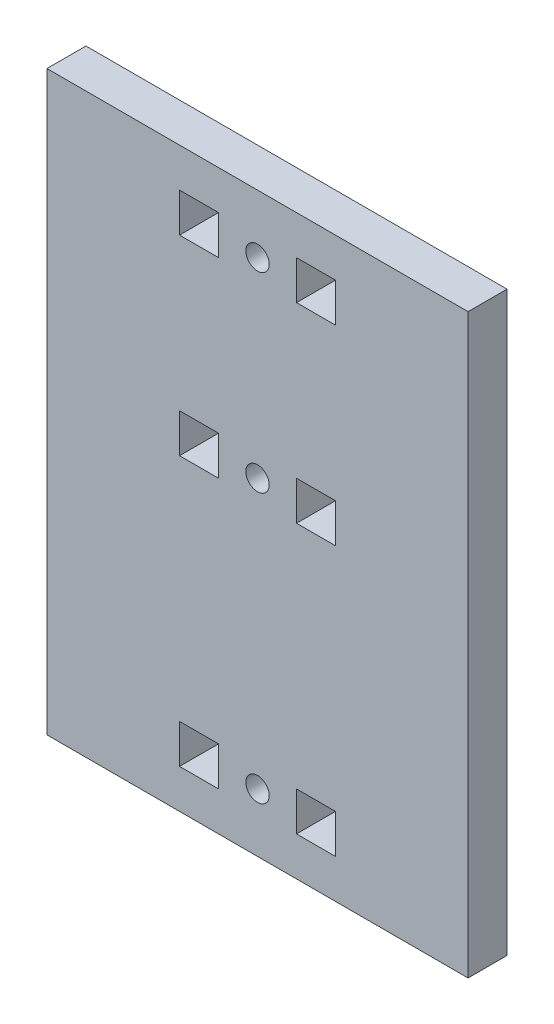
ISO-10303-21;
HEADER;
FILE_DESCRIPTION(('STEP AP214'),'2;1');
FILE_NAME('part.step','',(''),(''),'','','');
FILE_SCHEMA(('AUTOMOTIVE_DESIGN { 1 0 10303 214 1 1 1 1 }'));
ENDSEC;
DATA;
#1=APPLICATION_CONTEXT('core data for automotive mechanical design processes');
#2=APPLICATION_PROTOCOL_DEFINITION('international standard','automotive_design',2000,#1);
#3=PRODUCT_CONTEXT('',#1,'mechanical');
#4=PRODUCT('Part','Part','',(#3));
#5=PRODUCT_RELATED_PRODUCT_CATEGORY('part','',(#4));
#6=PRODUCT_DEFINITION_FORMATION('','',#4);
#7=PRODUCT_DEFINITION_CONTEXT('part definition',#1,'design');
#8=PRODUCT_DEFINITION('design','',#6,#7);
#9=PRODUCT_DEFINITION_SHAPE('','',#8);
#10=(LENGTH_UNIT() NAMED_UNIT(*) SI_UNIT(.MILLI.,.METRE.));
#11=(NAMED_UNIT(*) PLANE_ANGLE_UNIT() SI_UNIT($,.RADIAN.));
#12=(NAMED_UNIT(*) SI_UNIT($,.STERADIAN.) SOLID_ANGLE_UNIT());
#13=UNCERTAINTY_MEASURE_WITH_UNIT(LENGTH_MEASURE(1.E-05),#10,'distance_accuracy_value','');
#14=(GEOMETRIC_REPRESENTATION_CONTEXT(3) GLOBAL_UNCERTAINTY_ASSIGNED_CONTEXT((#13)) GLOBAL_UNIT_ASSIGNED_CONTEXT((#10,
#11,#12)) REPRESENTATION_CONTEXT('',''));
#15=CARTESIAN_POINT('',(0.,0.,0.));
#16=DIRECTION('',(0.,0.,1.));
#17=DIRECTION('',(1.,0.,0.));
#18=AXIS2_PLACEMENT_3D('',#15,#16,#17);
#19=CARTESIAN_POINT('',(0.,0.,5.));
#20=DIRECTION('',(0.,0.,-1.));
#21=DIRECTION('',(-1.,0.,0.));
#22=AXIS2_PLACEMENT_3D('',#19,#20,#21);
#23=PLANE('',#22);
#24=DIRECTION('',(0.,1.,0.));
#25=VECTOR('',#24,1.);
#26=CARTESIAN_POINT('',(-5.,-32.,5.));
#27=LINE('',#26,#25);
#28=CARTESIAN_POINT('',(-5.,-37.,5.));
#29=VERTEX_POINT('',#28);
#30=CARTESIAN_POINT('',(-5.,-32.,5.));
#31=VERTEX_POINT('',#30);
#32=EDGE_CURVE('E257',#29,#31,#27,.T.);
#33=ORIENTED_EDGE('',*,*,#32,.F.);
#34=DIRECTION('',(1.,0.,0.));
#35=VECTOR('',#34,1.);
#36=CARTESIAN_POINT('',(-5.,-37.,5.));
#37=LINE('',#36,#35);
#38=CARTESIAN_POINT('',(-10.,-37.,5.));
#39=VERTEX_POINT('',#38);
#40=EDGE_CURVE('E265',#39,#29,#37,.T.);
#41=ORIENTED_EDGE('',*,*,#40,.F.);
#42=DIRECTION('',(0.,-1.,0.));
#43=VECTOR('',#42,1.);
#44=CARTESIAN_POINT('',(-10.,-32.,5.));
#45=LINE('',#44,#43);
#46=CARTESIAN_POINT('',(-10.,-32.,5.));
#47=VERTEX_POINT('',#46);
#48=EDGE_CURVE('E262',#47,#39,#45,.T.);
#49=ORIENTED_EDGE('',*,*,#48,.F.);
#50=DIRECTION('',(-1.,0.,0.));
#51=VECTOR('',#50,1.);
#52=CARTESIAN_POINT('',(-5.,-32.,5.));
#53=LINE('',#52,#51);
#54=EDGE_CURVE('E259',#31,#47,#53,.T.);
#55=ORIENTED_EDGE('',*,*,#54,.F.);
#56=EDGE_LOOP('',(#33,#41,#49,#55));
#57=FACE_BOUND('',#56,.T.);
#58=DIRECTION('',(0.,1.,0.));
#59=VECTOR('',#58,1.);
#60=CARTESIAN_POINT('',(-5.,27.,5.));
#61=LINE('',#60,#59);
#62=CARTESIAN_POINT('',(-5.,22.,5.));
#63=VERTEX_POINT('',#62);
#64=CARTESIAN_POINT('',(-5.,27.,5.));
#65=VERTEX_POINT('',#64);
#66=EDGE_CURVE('E325',#63,#65,#61,.T.);
#67=ORIENTED_EDGE('',*,*,#66,.F.);
#68=DIRECTION('',(1.,0.,0.));
#69=VECTOR('',#68,1.);
#70=CARTESIAN_POINT('',(-5.,22.,5.));
#71=LINE('',#70,#69);
#72=CARTESIAN_POINT('',(-10.,22.,5.));
#73=VERTEX_POINT('',#72);
#74=EDGE_CURVE('E333',#73,#63,#71,.T.);
#75=ORIENTED_EDGE('',*,*,#74,.F.);
#76=DIRECTION('',(0.,-1.,0.));
#77=VECTOR('',#76,1.);
#78=CARTESIAN_POINT('',(-10.,27.,5.));
#79=LINE('',#78,#77);
#80=CARTESIAN_POINT('',(-10.,27.,5.));
#81=VERTEX_POINT('',#80);
#82=EDGE_CURVE('E330',#81,#73,#79,.T.);
#83=ORIENTED_EDGE('',*,*,#82,.F.);
#84=DIRECTION('',(-1.,0.,0.));
#85=VECTOR('',#84,1.);
#86=CARTESIAN_POINT('',(-5.,27.,5.));
#87=LINE('',#86,#85);
#88=EDGE_CURVE('E327',#65,#81,#87,.T.);
#89=ORIENTED_EDGE('',*,*,#88,.F.);
#90=EDGE_LOOP('',(#67,#75,#83,#89));
#91=FACE_BOUND('',#90,.T.);
#92=DIRECTION('',(0.,1.,0.));
#93=VECTOR('',#92,1.);
#94=CARTESIAN_POINT('',(-5.,2.5,5.));
#95=LINE('',#94,#93);
#96=CARTESIAN_POINT('',(-5.,-2.5,5.));
#97=VERTEX_POINT('',#96);
#98=CARTESIAN_POINT('',(-5.,2.5,5.));
#99=VERTEX_POINT('',#98);
#100=EDGE_CURVE('E393',#97,#99,#95,.T.);
#101=ORIENTED_EDGE('',*,*,#100,.F.);
#102=DIRECTION('',(1.,0.,0.));
#103=VECTOR('',#102,1.);
#104=CARTESIAN_POINT('',(-5.,-2.5,5.));
#105=LINE('',#104,#103);
#106=CARTESIAN_POINT('',(-10.,-2.5,5.));
#107=VERTEX_POINT('',#106);
#108=EDGE_CURVE('E401',#107,#97,#105,.T.);
#109=ORIENTED_EDGE('',*,*,#108,.F.);
#110=DIRECTION('',(0.,-1.,0.));
#111=VECTOR('',#110,1.);
#112=CARTESIAN_POINT('',(-10.,2.5,5.));
#113=LINE('',#112,#111);
#114=CARTESIAN_POINT('',(-10.,2.5,5.));
#115=VERTEX_POINT('',#114);
#116=EDGE_CURVE('E398',#115,#107,#113,.T.);
#117=ORIENTED_EDGE('',*,*,#116,.F.);
#118=DIRECTION('',(-1.,0.,0.));
#119=VECTOR('',#118,1.);
#120=CARTESIAN_POINT('',(-5.,2.5,5.));
#121=LINE('',#120,#119);
#122=EDGE_CURVE('E395',#99,#115,#121,.T.);
#123=ORIENTED_EDGE('',*,*,#122,.F.);
#124=EDGE_LOOP('',(#101,#109,#117,#123));
#125=FACE_BOUND('',#124,.T.);
#126=DIRECTION('',(0.,1.,0.));
#127=VECTOR('',#126,1.);
#128=CARTESIAN_POINT('',(27.,-42.,5.));
#129=LINE('',#128,#127);
#130=CARTESIAN_POINT('',(27.,-42.,5.));
#131=VERTEX_POINT('',#130);
#132=CARTESIAN_POINT('',(27.,32.,5.));
#133=VERTEX_POINT('',#132);
#134=EDGE_CURVE('E424',#131,#133,#129,.T.);
#135=ORIENTED_EDGE('',*,*,#134,.T.);
#136=DIRECTION('',(-1.,0.,0.));
#137=VECTOR('',#136,1.);
#138=CARTESIAN_POINT('',(-27.,32.,5.));
#139=LINE('',#138,#137);
#140=CARTESIAN_POINT('',(-27.,32.,5.));
#141=VERTEX_POINT('',#140);
#142=EDGE_CURVE('E427',#133,#141,#139,.T.);
#143=ORIENTED_EDGE('',*,*,#142,.T.);
#144=DIRECTION('',(0.,-1.,0.));
#145=VECTOR('',#144,1.);
#146=CARTESIAN_POINT('',(-27.,-42.,5.));
#147=LINE('',#146,#145);
#148=CARTESIAN_POINT('',(-27.,-42.,5.));
#149=VERTEX_POINT('',#148);
#150=EDGE_CURVE('E430',#141,#149,#147,.T.);
#151=ORIENTED_EDGE('',*,*,#150,.T.);
#152=DIRECTION('',(1.,0.,0.));
#153=VECTOR('',#152,1.);
#154=CARTESIAN_POINT('',(-27.,-42.,5.));
#155=LINE('',#154,#153);
#156=EDGE_CURVE('E432',#149,#131,#155,.T.);
#157=ORIENTED_EDGE('',*,*,#156,.T.);
#158=EDGE_LOOP('',(#135,#143,#151,#157));
#159=FACE_BOUND('',#158,.T.);
#160=DIRECTION('',(0.,-1.,0.));
#161=VECTOR('',#160,1.);
#162=CARTESIAN_POINT('',(5.,2.5,5.));
#163=LINE('',#162,#161);
#164=CARTESIAN_POINT('',(5.,2.5,5.));
#165=VERTEX_POINT('',#164);
#166=CARTESIAN_POINT('',(5.,-2.5,5.));
#167=VERTEX_POINT('',#166);
#168=EDGE_CURVE('E362',#165,#167,#163,.T.);
#169=ORIENTED_EDGE('',*,*,#168,.F.);
#170=DIRECTION('',(-1.,0.,0.));
#171=VECTOR('',#170,1.);
#172=CARTESIAN_POINT('',(5.,2.5,5.));
#173=LINE('',#172,#171);
#174=CARTESIAN_POINT('',(10.,2.5,5.));
#175=VERTEX_POINT('',#174);
#176=EDGE_CURVE('E370',#175,#165,#173,.T.);
#177=ORIENTED_EDGE('',*,*,#176,.F.);
#178=DIRECTION('',(0.,1.,0.));
#179=VECTOR('',#178,1.);
#180=CARTESIAN_POINT('',(10.,2.5,5.));
#181=LINE('',#180,#179);
#182=CARTESIAN_POINT('',(10.,-2.5,5.));
#183=VERTEX_POINT('',#182);
#184=EDGE_CURVE('E367',#183,#175,#181,.T.);
#185=ORIENTED_EDGE('',*,*,#184,.F.);
#186=DIRECTION('',(1.,0.,0.));
#187=VECTOR('',#186,1.);
#188=CARTESIAN_POINT('',(5.,-2.5,5.));
#189=LINE('',#188,#187);
#190=EDGE_CURVE('E364',#167,#183,#189,.T.);
#191=ORIENTED_EDGE('',*,*,#190,.F.);
#192=EDGE_LOOP('',(#169,#177,#185,#191));
#193=FACE_BOUND('',#192,.T.);
#194=CARTESIAN_POINT('',(0.,0.,5.));
#195=DIRECTION('',(0.,0.,1.));
#196=DIRECTION('',(1.,0.,0.));
#197=AXIS2_PLACEMENT_3D('',#194,#195,#196);
#198=CIRCLE('',#197,1.5);
#199=CARTESIAN_POINT('',(1.5,0.,5.));
#200=VERTEX_POINT('',#199);
#201=EDGE_CURVE('E356',#200,#200,#198,.T.);
#202=ORIENTED_EDGE('',*,*,#201,.F.);
#203=EDGE_LOOP('',(#202));
#204=FACE_BOUND('',#203,.T.);
#205=DIRECTION('',(0.,-1.,0.));
#206=VECTOR('',#205,1.);
#207=CARTESIAN_POINT('',(5.,27.,5.));
#208=LINE('',#207,#206);
#209=CARTESIAN_POINT('',(5.,27.,5.));
#210=VERTEX_POINT('',#209);
#211=CARTESIAN_POINT('',(5.,22.,5.));
#212=VERTEX_POINT('',#211);
#213=EDGE_CURVE('E294',#210,#212,#208,.T.);
#214=ORIENTED_EDGE('',*,*,#213,.F.);
#215=DIRECTION('',(-1.,0.,0.));
#216=VECTOR('',#215,1.);
#217=CARTESIAN_POINT('',(5.,27.,5.));
#218=LINE('',#217,#216);
#219=CARTESIAN_POINT('',(10.,27.,5.));
#220=VERTEX_POINT('',#219);
#221=EDGE_CURVE('E302',#220,#210,#218,.T.);
#222=ORIENTED_EDGE('',*,*,#221,.F.);
#223=DIRECTION('',(0.,1.,0.));
#224=VECTOR('',#223,1.);
#225=CARTESIAN_POINT('',(10.,27.,5.));
#226=LINE('',#225,#224);
#227=CARTESIAN_POINT('',(10.,22.,5.));
#228=VERTEX_POINT('',#227);
#229=EDGE_CURVE('E299',#228,#220,#226,.T.);
#230=ORIENTED_EDGE('',*,*,#229,.F.);
#231=DIRECTION('',(1.,0.,0.));
#232=VECTOR('',#231,1.);
#233=CARTESIAN_POINT('',(5.,22.,5.));
#234=LINE('',#233,#232);
#235=EDGE_CURVE('E296',#212,#228,#234,.T.);
#236=ORIENTED_EDGE('',*,*,#235,.F.);
#237=EDGE_LOOP('',(#214,#222,#230,#236));
#238=FACE_BOUND('',#237,.T.);
#239=CARTESIAN_POINT('',(0.,24.5,5.));
#240=DIRECTION('',(0.,0.,1.));
#241=DIRECTION('',(1.,0.,0.));
#242=AXIS2_PLACEMENT_3D('',#239,#240,#241);
#243=CIRCLE('',#242,1.5);
#244=CARTESIAN_POINT('',(1.5,24.5,5.));
#245=VERTEX_POINT('',#244);
#246=EDGE_CURVE('E288',#245,#245,#243,.T.);
#247=ORIENTED_EDGE('',*,*,#246,.F.);
#248=EDGE_LOOP('',(#247));
#249=FACE_BOUND('',#248,.T.);
#250=DIRECTION('',(0.,-1.,0.));
#251=VECTOR('',#250,1.);
#252=CARTESIAN_POINT('',(5.,-32.,5.));
#253=LINE('',#252,#251);
#254=CARTESIAN_POINT('',(5.,-32.,5.));
#255=VERTEX_POINT('',#254);
#256=CARTESIAN_POINT('',(5.,-37.,5.));
#257=VERTEX_POINT('',#256);
#258=EDGE_CURVE('E218',#255,#257,#253,.T.);
#259=ORIENTED_EDGE('',*,*,#258,.F.);
#260=DIRECTION('',(-1.,0.,0.));
#261=VECTOR('',#260,1.);
#262=CARTESIAN_POINT('',(5.,-32.,5.));
#263=LINE('',#262,#261);
#264=CARTESIAN_POINT('',(10.,-32.,5.));
#265=VERTEX_POINT('',#264);
#266=EDGE_CURVE('E241',#265,#255,#263,.T.);
#267=ORIENTED_EDGE('',*,*,#266,.F.);
#268=DIRECTION('',(0.,1.,0.));
#269=VECTOR('',#268,1.);
#270=CARTESIAN_POINT('',(10.,-32.,5.));
#271=LINE('',#270,#269);
#272=CARTESIAN_POINT('',(10.,-37.,5.));
#273=VERTEX_POINT('',#272);
#274=EDGE_CURVE('E239',#273,#265,#271,.T.);
#275=ORIENTED_EDGE('',*,*,#274,.F.);
#276=DIRECTION('',(1.,0.,0.));
#277=VECTOR('',#276,1.);
#278=CARTESIAN_POINT('',(5.,-37.,5.));
#279=LINE('',#278,#277);
#280=EDGE_CURVE('E226',#257,#273,#279,.T.);
#281=ORIENTED_EDGE('',*,*,#280,.F.);
#282=EDGE_LOOP('',(#259,#267,#275,#281));
#283=FACE_BOUND('',#282,.T.);
#284=CARTESIAN_POINT('',(0.,-34.5,5.));
#285=DIRECTION('',(0.,0.,1.));
#286=DIRECTION('',(1.,0.,0.));
#287=AXIS2_PLACEMENT_3D('',#284,#285,#286);
#288=CIRCLE('',#287,1.5);
#289=CARTESIAN_POINT('',(1.5,-34.5,5.));
#290=VERTEX_POINT('',#289);
#291=EDGE_CURVE('E247',#290,#290,#288,.T.);
#292=ORIENTED_EDGE('',*,*,#291,.F.);
#293=EDGE_LOOP('',(#292));
#294=FACE_BOUND('',#293,.T.);
#295=ADVANCED_FACE('F33',(#57,#91,#125,#159,#193,#204,#238,#249,#283,#294),#23,.F.);
#296=CARTESIAN_POINT('',(0.,0.,0.));
#297=DIRECTION('',(0.,0.,-1.));
#298=DIRECTION('',(-1.,0.,0.));
#299=AXIS2_PLACEMENT_3D('',#296,#297,#298);
#300=PLANE('',#299);
#301=DIRECTION('',(-1.,0.,0.));
#302=VECTOR('',#301,1.);
#303=CARTESIAN_POINT('',(5.,-32.,0.));
#304=LINE('',#303,#302);
#305=CARTESIAN_POINT('',(10.,-32.,0.));
#306=VERTEX_POINT('',#305);
#307=CARTESIAN_POINT('',(5.,-32.,0.));
#308=VERTEX_POINT('',#307);
#309=EDGE_CURVE('E227',#306,#308,#304,.T.);
#310=ORIENTED_EDGE('',*,*,#309,.T.);
#311=DIRECTION('',(0.,-1.,0.));
#312=VECTOR('',#311,1.);
#313=CARTESIAN_POINT('',(5.,-32.,0.));
#314=LINE('',#313,#312);
#315=CARTESIAN_POINT('',(5.,-37.,0.));
#316=VERTEX_POINT('',#315);
#317=EDGE_CURVE('E56',#308,#316,#314,.T.);
#318=ORIENTED_EDGE('',*,*,#317,.T.);
#319=DIRECTION('',(1.,0.,0.));
#320=VECTOR('',#319,1.);
#321=CARTESIAN_POINT('',(5.,-37.,0.));
#322=LINE('',#321,#320);
#323=CARTESIAN_POINT('',(10.,-37.,0.));
#324=VERTEX_POINT('',#323);
#325=EDGE_CURVE('E233',#316,#324,#322,.T.);
#326=ORIENTED_EDGE('',*,*,#325,.T.);
#327=DIRECTION('',(0.,1.,0.));
#328=VECTOR('',#327,1.);
#329=CARTESIAN_POINT('',(10.,-32.,0.));
#330=LINE('',#329,#328);
#331=EDGE_CURVE('E249',#324,#306,#330,.T.);
#332=ORIENTED_EDGE('',*,*,#331,.T.);
#333=EDGE_LOOP('',(#310,#318,#326,#332));
#334=FACE_BOUND('',#333,.T.);
#335=DIRECTION('',(1.,0.,0.));
#336=VECTOR('',#335,1.);
#337=CARTESIAN_POINT('',(-5.,-37.,0.));
#338=LINE('',#337,#336);
#339=CARTESIAN_POINT('',(-10.,-37.,0.));
#340=VERTEX_POINT('',#339);
#341=CARTESIAN_POINT('',(-5.,-37.,0.));
#342=VERTEX_POINT('',#341);
#343=EDGE_CURVE('E260',#340,#342,#338,.T.);
#344=ORIENTED_EDGE('',*,*,#343,.T.);
#345=DIRECTION('',(0.,1.,0.));
#346=VECTOR('',#345,1.);
#347=CARTESIAN_POINT('',(-5.,-32.,0.));
#348=LINE('',#347,#346);
#349=CARTESIAN_POINT('',(-5.,-32.,0.));
#350=VERTEX_POINT('',#349);
#351=EDGE_CURVE('E234',#342,#350,#348,.T.);
#352=ORIENTED_EDGE('',*,*,#351,.T.);
#353=DIRECTION('',(-1.,0.,0.));
#354=VECTOR('',#353,1.);
#355=CARTESIAN_POINT('',(-5.,-32.,0.));
#356=LINE('',#355,#354);
#357=CARTESIAN_POINT('',(-10.,-32.,0.));
#358=VERTEX_POINT('',#357);
#359=EDGE_CURVE('E270',#350,#358,#356,.T.);
#360=ORIENTED_EDGE('',*,*,#359,.T.);
#361=DIRECTION('',(0.,-1.,0.));
#362=VECTOR('',#361,1.);
#363=CARTESIAN_POINT('',(-10.,-32.,0.));
#364=LINE('',#363,#362);
#365=EDGE_CURVE('E273',#358,#340,#364,.T.);
#366=ORIENTED_EDGE('',*,*,#365,.T.);
#367=EDGE_LOOP('',(#344,#352,#360,#366));
#368=FACE_BOUND('',#367,.T.);
#369=CARTESIAN_POINT('',(0.,24.5,0.));
#370=DIRECTION('',(0.,0.,1.));
#371=DIRECTION('',(1.,0.,0.));
#372=AXIS2_PLACEMENT_3D('',#369,#370,#371);
#373=CIRCLE('',#372,1.5);
#374=CARTESIAN_POINT('',(1.5,24.5,0.));
#375=VERTEX_POINT('',#374);
#376=EDGE_CURVE('E287',#375,#375,#373,.T.);
#377=ORIENTED_EDGE('',*,*,#376,.T.);
#378=EDGE_LOOP('',(#377));
#379=FACE_BOUND('',#378,.T.);
#380=DIRECTION('',(-1.,0.,0.));
#381=VECTOR('',#380,1.);
#382=CARTESIAN_POINT('',(5.,2.5,0.));
#383=LINE('',#382,#381);
#384=CARTESIAN_POINT('',(10.,2.5,0.));
#385=VERTEX_POINT('',#384);
#386=CARTESIAN_POINT('',(5.,2.5,0.));
#387=VERTEX_POINT('',#386);
#388=EDGE_CURVE('E365',#385,#387,#383,.T.);
#389=ORIENTED_EDGE('',*,*,#388,.T.);
#390=DIRECTION('',(0.,-1.,0.));
#391=VECTOR('',#390,1.);
#392=CARTESIAN_POINT('',(5.,2.5,0.));
#393=LINE('',#392,#391);
#394=CARTESIAN_POINT('',(5.,-2.5,0.));
#395=VERTEX_POINT('',#394);
#396=EDGE_CURVE('E359',#387,#395,#393,.T.);
#397=ORIENTED_EDGE('',*,*,#396,.T.);
#398=DIRECTION('',(1.,0.,0.));
#399=VECTOR('',#398,1.);
#400=CARTESIAN_POINT('',(5.,-2.5,0.));
#401=LINE('',#400,#399);
#402=CARTESIAN_POINT('',(10.,-2.5,0.));
#403=VERTEX_POINT('',#402);
#404=EDGE_CURVE('E375',#395,#403,#401,.T.);
#405=ORIENTED_EDGE('',*,*,#404,.T.);
#406=DIRECTION('',(0.,1.,0.));
#407=VECTOR('',#406,1.);
#408=CARTESIAN_POINT('',(10.,2.5,0.));
#409=LINE('',#408,#407);
#410=EDGE_CURVE('E378',#403,#385,#409,.T.);
#411=ORIENTED_EDGE('',*,*,#410,.T.);
#412=EDGE_LOOP('',(#389,#397,#405,#411));
#413=FACE_BOUND('',#412,.T.);
#414=DIRECTION('',(1.,0.,0.));
#415=VECTOR('',#414,1.);
#416=CARTESIAN_POINT('',(-5.,-2.5,0.));
#417=LINE('',#416,#415);
#418=CARTESIAN_POINT('',(-10.,-2.5,0.));
#419=VERTEX_POINT('',#418);
#420=CARTESIAN_POINT('',(-5.,-2.5,0.));
#421=VERTEX_POINT('',#420);
#422=EDGE_CURVE('E396',#419,#421,#417,.T.);
#423=ORIENTED_EDGE('',*,*,#422,.T.);
#424=DIRECTION('',(0.,1.,0.));
#425=VECTOR('',#424,1.);
#426=CARTESIAN_POINT('',(-5.,2.5,0.));
#427=LINE('',#426,#425);
#428=CARTESIAN_POINT('',(-5.,2.5,0.));
#429=VERTEX_POINT('',#428);
#430=EDGE_CURVE('E392',#421,#429,#427,.T.);
#431=ORIENTED_EDGE('',*,*,#430,.T.);
#432=DIRECTION('',(-1.,0.,0.));
#433=VECTOR('',#432,1.);
#434=CARTESIAN_POINT('',(-5.,2.5,0.));
#435=LINE('',#434,#433);
#436=CARTESIAN_POINT('',(-10.,2.5,0.));
#437=VERTEX_POINT('',#436);
#438=EDGE_CURVE('E406',#429,#437,#435,.T.);
#439=ORIENTED_EDGE('',*,*,#438,.T.);
#440=DIRECTION('',(0.,-1.,0.));
#441=VECTOR('',#440,1.);
#442=CARTESIAN_POINT('',(-10.,2.5,0.));
#443=LINE('',#442,#441);
#444=EDGE_CURVE('E409',#437,#419,#443,.T.);
#445=ORIENTED_EDGE('',*,*,#444,.T.);
#446=EDGE_LOOP('',(#423,#431,#439,#445));
#447=FACE_BOUND('',#446,.T.);
#448=DIRECTION('',(0.,1.,0.));
#449=VECTOR('',#448,1.);
#450=CARTESIAN_POINT('',(27.,-42.,0.));
#451=LINE('',#450,#449);
#452=CARTESIAN_POINT('',(27.,-42.,0.));
#453=VERTEX_POINT('',#452);
#454=CARTESIAN_POINT('',(27.,32.,0.));
#455=VERTEX_POINT('',#454);
#456=EDGE_CURVE('E423',#453,#455,#451,.T.);
#457=ORIENTED_EDGE('',*,*,#456,.F.);
#458=DIRECTION('',(1.,0.,0.));
#459=VECTOR('',#458,1.);
#460=CARTESIAN_POINT('',(-27.,-42.,0.));
#461=LINE('',#460,#459);
#462=CARTESIAN_POINT('',(-27.,-42.,0.));
#463=VERTEX_POINT('',#462);
#464=EDGE_CURVE('E428',#463,#453,#461,.T.);
#465=ORIENTED_EDGE('',*,*,#464,.F.);
#466=DIRECTION('',(0.,-1.,0.));
#467=VECTOR('',#466,1.);
#468=CARTESIAN_POINT('',(-27.,-42.,0.));
#469=LINE('',#468,#467);
#470=CARTESIAN_POINT('',(-27.,32.,0.));
#471=VERTEX_POINT('',#470);
#472=EDGE_CURVE('E439',#471,#463,#469,.T.);
#473=ORIENTED_EDGE('',*,*,#472,.F.);
#474=DIRECTION('',(-1.,0.,0.));
#475=VECTOR('',#474,1.);
#476=CARTESIAN_POINT('',(-27.,32.,0.));
#477=LINE('',#476,#475);
#478=EDGE_CURVE('E437',#455,#471,#477,.T.);
#479=ORIENTED_EDGE('',*,*,#478,.F.);
#480=EDGE_LOOP('',(#457,#465,#473,#479));
#481=FACE_BOUND('',#480,.T.);
#482=CARTESIAN_POINT('',(0.,0.,0.));
#483=DIRECTION('',(0.,0.,1.));
#484=DIRECTION('',(1.,0.,0.));
#485=AXIS2_PLACEMENT_3D('',#482,#483,#484);
#486=CIRCLE('',#485,1.5);
#487=CARTESIAN_POINT('',(1.5,0.,0.));
#488=VERTEX_POINT('',#487);
#489=EDGE_CURVE('E355',#488,#488,#486,.T.);
#490=ORIENTED_EDGE('',*,*,#489,.T.);
#491=EDGE_LOOP('',(#490));
#492=FACE_BOUND('',#491,.T.);
#493=DIRECTION('',(1.,0.,0.));
#494=VECTOR('',#493,1.);
#495=CARTESIAN_POINT('',(-5.,22.,0.));
#496=LINE('',#495,#494);
#497=CARTESIAN_POINT('',(-10.,22.,0.));
#498=VERTEX_POINT('',#497);
#499=CARTESIAN_POINT('',(-5.,22.,0.));
#500=VERTEX_POINT('',#499);
#501=EDGE_CURVE('E328',#498,#500,#496,.T.);
#502=ORIENTED_EDGE('',*,*,#501,.T.);
#503=DIRECTION('',(0.,1.,0.));
#504=VECTOR('',#503,1.);
#505=CARTESIAN_POINT('',(-5.,27.,0.));
#506=LINE('',#505,#504);
#507=CARTESIAN_POINT('',(-5.,27.,0.));
#508=VERTEX_POINT('',#507);
#509=EDGE_CURVE('E324',#500,#508,#506,.T.);
#510=ORIENTED_EDGE('',*,*,#509,.T.);
#511=DIRECTION('',(-1.,0.,0.));
#512=VECTOR('',#511,1.);
#513=CARTESIAN_POINT('',(-5.,27.,0.));
#514=LINE('',#513,#512);
#515=CARTESIAN_POINT('',(-10.,27.,0.));
#516=VERTEX_POINT('',#515);
#517=EDGE_CURVE('E338',#508,#516,#514,.T.);
#518=ORIENTED_EDGE('',*,*,#517,.T.);
#519=DIRECTION('',(0.,-1.,0.));
#520=VECTOR('',#519,1.);
#521=CARTESIAN_POINT('',(-10.,27.,0.));
#522=LINE('',#521,#520);
#523=EDGE_CURVE('E341',#516,#498,#522,.T.);
#524=ORIENTED_EDGE('',*,*,#523,.T.);
#525=EDGE_LOOP('',(#502,#510,#518,#524));
#526=FACE_BOUND('',#525,.T.);
#527=DIRECTION('',(-1.,0.,0.));
#528=VECTOR('',#527,1.);
#529=CARTESIAN_POINT('',(5.,27.,0.));
#530=LINE('',#529,#528);
#531=CARTESIAN_POINT('',(10.,27.,0.));
#532=VERTEX_POINT('',#531);
#533=CARTESIAN_POINT('',(5.,27.,0.));
#534=VERTEX_POINT('',#533);
#535=EDGE_CURVE('E297',#532,#534,#530,.T.);
#536=ORIENTED_EDGE('',*,*,#535,.T.);
#537=DIRECTION('',(0.,-1.,0.));
#538=VECTOR('',#537,1.);
#539=CARTESIAN_POINT('',(5.,27.,0.));
#540=LINE('',#539,#538);
#541=CARTESIAN_POINT('',(5.,22.,0.));
#542=VERTEX_POINT('',#541);
#543=EDGE_CURVE('E291',#534,#542,#540,.T.);
#544=ORIENTED_EDGE('',*,*,#543,.T.);
#545=DIRECTION('',(1.,0.,0.));
#546=VECTOR('',#545,1.);
#547=CARTESIAN_POINT('',(5.,22.,0.));
#548=LINE('',#547,#546);
#549=CARTESIAN_POINT('',(10.,22.,0.));
#550=VERTEX_POINT('',#549);
#551=EDGE_CURVE('E307',#542,#550,#548,.T.);
#552=ORIENTED_EDGE('',*,*,#551,.T.);
#553=DIRECTION('',(0.,1.,0.));
#554=VECTOR('',#553,1.);
#555=CARTESIAN_POINT('',(10.,27.,0.));
#556=LINE('',#555,#554);
#557=EDGE_CURVE('E310',#550,#532,#556,.T.);
#558=ORIENTED_EDGE('',*,*,#557,.T.);
#559=EDGE_LOOP('',(#536,#544,#552,#558));
#560=FACE_BOUND('',#559,.T.);
#561=CARTESIAN_POINT('',(0.,-34.5,0.));
#562=DIRECTION('',(0.,0.,1.));
#563=DIRECTION('',(1.,0.,0.));
#564=AXIS2_PLACEMENT_3D('',#561,#562,#563);
#565=CIRCLE('',#564,1.5);
#566=CARTESIAN_POINT('',(1.5,-34.5,0.));
#567=VERTEX_POINT('',#566);
#568=EDGE_CURVE('E614',#567,#567,#565,.T.);
#569=ORIENTED_EDGE('',*,*,#568,.T.);
#570=EDGE_LOOP('',(#569));
#571=FACE_BOUND('',#570,.T.);
#572=ADVANCED_FACE('F457',(#334,#368,#379,#413,#447,#481,#492,#526,#560,#571),#300,.T.);
#573=CARTESIAN_POINT('',(27.,-42.,5.));
#574=DIRECTION('',(-1.,0.,0.));
#575=DIRECTION('',(0.,0.,1.));
#576=AXIS2_PLACEMENT_3D('',#573,#574,#575);
#577=PLANE('',#576);
#578=ORIENTED_EDGE('',*,*,#456,.T.);
#579=DIRECTION('',(0.,0.,-1.));
#580=VECTOR('',#579,1.);
#581=CARTESIAN_POINT('',(27.,32.,5.));
#582=LINE('',#581,#580);
#583=EDGE_CURVE('E11',#133,#455,#582,.T.);
#584=ORIENTED_EDGE('',*,*,#583,.F.);
#585=ORIENTED_EDGE('',*,*,#134,.F.);
#586=DIRECTION('',(0.,0.,-1.));
#587=VECTOR('',#586,1.);
#588=CARTESIAN_POINT('',(27.,-42.,5.));
#589=LINE('',#588,#587);
#590=EDGE_CURVE('E434',#131,#453,#589,.T.);
#591=ORIENTED_EDGE('',*,*,#590,.T.);
#592=EDGE_LOOP('',(#578,#584,#585,#591));
#593=FACE_BOUND('',#592,.T.);
#594=ADVANCED_FACE('F35',(#593),#577,.F.);
#595=CARTESIAN_POINT('',(-27.,32.,5.));
#596=DIRECTION('',(0.,-1.,0.));
#597=DIRECTION('',(0.,0.,-1.));
#598=AXIS2_PLACEMENT_3D('',#595,#596,#597);
#599=PLANE('',#598);
#600=ORIENTED_EDGE('',*,*,#478,.T.);
#601=DIRECTION('',(0.,0.,-1.));
#602=VECTOR('',#601,1.);
#603=CARTESIAN_POINT('',(-27.,32.,5.));
#604=LINE('',#603,#602);
#605=EDGE_CURVE('E41',#141,#471,#604,.T.);
#606=ORIENTED_EDGE('',*,*,#605,.F.);
#607=ORIENTED_EDGE('',*,*,#142,.F.);
#608=ORIENTED_EDGE('',*,*,#583,.T.);
#609=EDGE_LOOP('',(#600,#606,#607,#608));
#610=FACE_BOUND('',#609,.T.);
#611=ADVANCED_FACE('F468',(#610),#599,.F.);
#612=CARTESIAN_POINT('',(-27.,-42.,5.));
#613=DIRECTION('',(1.,0.,0.));
#614=DIRECTION('',(0.,0.,-1.));
#615=AXIS2_PLACEMENT_3D('',#612,#613,#614);
#616=PLANE('',#615);
#617=ORIENTED_EDGE('',*,*,#472,.T.);
#618=DIRECTION('',(0.,0.,-1.));
#619=VECTOR('',#618,1.);
#620=CARTESIAN_POINT('',(-27.,-42.,5.));
#621=LINE('',#620,#619);
#622=EDGE_CURVE('E444',#149,#463,#621,.T.);
#623=ORIENTED_EDGE('',*,*,#622,.F.);
#624=ORIENTED_EDGE('',*,*,#150,.F.);
#625=ORIENTED_EDGE('',*,*,#605,.T.);
#626=EDGE_LOOP('',(#617,#623,#624,#625));
#627=FACE_BOUND('',#626,.T.);
#628=ADVANCED_FACE('F451',(#627),#616,.F.);
#629=CARTESIAN_POINT('',(-27.,-42.,5.));
#630=DIRECTION('',(0.,1.,0.));
#631=DIRECTION('',(0.,0.,1.));
#632=AXIS2_PLACEMENT_3D('',#629,#630,#631);
#633=PLANE('',#632);
#634=ORIENTED_EDGE('',*,*,#464,.T.);
#635=ORIENTED_EDGE('',*,*,#590,.F.);
#636=ORIENTED_EDGE('',*,*,#156,.F.);
#637=ORIENTED_EDGE('',*,*,#622,.T.);
#638=EDGE_LOOP('',(#634,#635,#636,#637));
#639=FACE_BOUND('',#638,.T.);
#640=ADVANCED_FACE('F461',(#639),#633,.F.);
#641=CARTESIAN_POINT('',(-5.,2.5,5.));
#642=DIRECTION('',(-1.,0.,0.));
#643=DIRECTION('',(0.,0.,1.));
#644=AXIS2_PLACEMENT_3D('',#641,#642,#643);
#645=PLANE('',#644);
#646=ORIENTED_EDGE('',*,*,#430,.F.);
#647=DIRECTION('',(0.,0.,-1.));
#648=VECTOR('',#647,1.);
#649=CARTESIAN_POINT('',(-5.,-2.5,5.));
#650=LINE('',#649,#648);
#651=EDGE_CURVE('E403',#97,#421,#650,.T.);
#652=ORIENTED_EDGE('',*,*,#651,.F.);
#653=ORIENTED_EDGE('',*,*,#100,.T.);
#654=DIRECTION('',(0.,0.,-1.));
#655=VECTOR('',#654,1.);
#656=CARTESIAN_POINT('',(-5.,2.5,5.));
#657=LINE('',#656,#655);
#658=EDGE_CURVE('E420',#99,#429,#657,.T.);
#659=ORIENTED_EDGE('',*,*,#658,.T.);
#660=EDGE_LOOP('',(#646,#652,#653,#659));
#661=FACE_BOUND('',#660,.T.);
#662=ADVANCED_FACE('F486',(#661),#645,.T.);
#663=CARTESIAN_POINT('',(-5.,2.5,5.));
#664=DIRECTION('',(0.,-1.,0.));
#665=DIRECTION('',(1.,0.,0.));
#666=AXIS2_PLACEMENT_3D('',#663,#664,#665);
#667=PLANE('',#666);
#668=ORIENTED_EDGE('',*,*,#438,.F.);
#669=ORIENTED_EDGE('',*,*,#658,.F.);
#670=ORIENTED_EDGE('',*,*,#122,.T.);
#671=DIRECTION('',(0.,0.,-1.));
#672=VECTOR('',#671,1.);
#673=CARTESIAN_POINT('',(-10.,2.5,5.));
#674=LINE('',#673,#672);
#675=EDGE_CURVE('E418',#115,#437,#674,.T.);
#676=ORIENTED_EDGE('',*,*,#675,.T.);
#677=EDGE_LOOP('',(#668,#669,#670,#676));
#678=FACE_BOUND('',#677,.T.);
#679=ADVANCED_FACE('F493',(#678),#667,.T.);
#680=CARTESIAN_POINT('',(-10.,2.5,5.));
#681=DIRECTION('',(1.,0.,0.));
#682=DIRECTION('',(0.,0.,-1.));
#683=AXIS2_PLACEMENT_3D('',#680,#681,#682);
#684=PLANE('',#683);
#685=ORIENTED_EDGE('',*,*,#444,.F.);
#686=ORIENTED_EDGE('',*,*,#675,.F.);
#687=ORIENTED_EDGE('',*,*,#116,.T.);
#688=DIRECTION('',(0.,0.,-1.));
#689=VECTOR('',#688,1.);
#690=CARTESIAN_POINT('',(-10.,-2.5,5.));
#691=LINE('',#690,#689);
#692=EDGE_CURVE('E416',#107,#419,#691,.T.);
#693=ORIENTED_EDGE('',*,*,#692,.T.);
#694=EDGE_LOOP('',(#685,#686,#687,#693));
#695=FACE_BOUND('',#694,.T.);
#696=ADVANCED_FACE('F498',(#695),#684,.T.);
#697=CARTESIAN_POINT('',(-5.,-2.5,5.));
#698=DIRECTION('',(0.,1.,0.));
#699=DIRECTION('',(-1.,0.,0.));
#700=AXIS2_PLACEMENT_3D('',#697,#698,#699);
#701=PLANE('',#700);
#702=ORIENTED_EDGE('',*,*,#422,.F.);
#703=ORIENTED_EDGE('',*,*,#692,.F.);
#704=ORIENTED_EDGE('',*,*,#108,.T.);
#705=ORIENTED_EDGE('',*,*,#651,.T.);
#706=EDGE_LOOP('',(#702,#703,#704,#705));
#707=FACE_BOUND('',#706,.T.);
#708=ADVANCED_FACE('F506',(#707),#701,.T.);
#709=CARTESIAN_POINT('',(5.,2.5,5.));
#710=DIRECTION('',(1.,0.,0.));
#711=DIRECTION('',(0.,0.,-1.));
#712=AXIS2_PLACEMENT_3D('',#709,#710,#711);
#713=PLANE('',#712);
#714=ORIENTED_EDGE('',*,*,#396,.F.);
#715=DIRECTION('',(0.,0.,-1.));
#716=VECTOR('',#715,1.);
#717=CARTESIAN_POINT('',(5.,2.5,5.));
#718=LINE('',#717,#716);
#719=EDGE_CURVE('E372',#165,#387,#718,.T.);
#720=ORIENTED_EDGE('',*,*,#719,.F.);
#721=ORIENTED_EDGE('',*,*,#168,.T.);
#722=DIRECTION('',(0.,0.,-1.));
#723=VECTOR('',#722,1.);
#724=CARTESIAN_POINT('',(5.,-2.5,5.));
#725=LINE('',#724,#723);
#726=EDGE_CURVE('E389',#167,#395,#725,.T.);
#727=ORIENTED_EDGE('',*,*,#726,.T.);
#728=EDGE_LOOP('',(#714,#720,#721,#727));
#729=FACE_BOUND('',#728,.T.);
#730=ADVANCED_FACE('F519',(#729),#713,.T.);
#731=CARTESIAN_POINT('',(5.,-2.5,5.));
#732=DIRECTION('',(0.,1.,0.));
#733=DIRECTION('',(0.,0.,1.));
#734=AXIS2_PLACEMENT_3D('',#731,#732,#733);
#735=PLANE('',#734);
#736=ORIENTED_EDGE('',*,*,#404,.F.);
#737=ORIENTED_EDGE('',*,*,#726,.F.);
#738=ORIENTED_EDGE('',*,*,#190,.T.);
#739=DIRECTION('',(0.,0.,-1.));
#740=VECTOR('',#739,1.);
#741=CARTESIAN_POINT('',(10.,-2.5,5.));
#742=LINE('',#741,#740);
#743=EDGE_CURVE('E387',#183,#403,#742,.T.);
#744=ORIENTED_EDGE('',*,*,#743,.T.);
#745=EDGE_LOOP('',(#736,#737,#738,#744));
#746=FACE_BOUND('',#745,.T.);
#747=ADVANCED_FACE('F524',(#746),#735,.T.);
#748=CARTESIAN_POINT('',(10.,2.5,5.));
#749=DIRECTION('',(-1.,0.,0.));
#750=DIRECTION('',(0.,0.,1.));
#751=AXIS2_PLACEMENT_3D('',#748,#749,#750);
#752=PLANE('',#751);
#753=ORIENTED_EDGE('',*,*,#410,.F.);
#754=ORIENTED_EDGE('',*,*,#743,.F.);
#755=ORIENTED_EDGE('',*,*,#184,.T.);
#756=DIRECTION('',(0.,0.,-1.));
#757=VECTOR('',#756,1.);
#758=CARTESIAN_POINT('',(10.,2.5,5.));
#759=LINE('',#758,#757);
#760=EDGE_CURVE('E385',#175,#385,#759,.T.);
#761=ORIENTED_EDGE('',*,*,#760,.T.);
#762=EDGE_LOOP('',(#753,#754,#755,#761));
#763=FACE_BOUND('',#762,.T.);
#764=ADVANCED_FACE('F528',(#763),#752,.T.);
#765=CARTESIAN_POINT('',(5.,2.5,5.));
#766=DIRECTION('',(0.,-1.,0.));
#767=DIRECTION('',(0.,0.,-1.));
#768=AXIS2_PLACEMENT_3D('',#765,#766,#767);
#769=PLANE('',#768);
#770=ORIENTED_EDGE('',*,*,#388,.F.);
#771=ORIENTED_EDGE('',*,*,#760,.F.);
#772=ORIENTED_EDGE('',*,*,#176,.T.);
#773=ORIENTED_EDGE('',*,*,#719,.T.);
#774=EDGE_LOOP('',(#770,#771,#772,#773));
#775=FACE_BOUND('',#774,.T.);
#776=ADVANCED_FACE('F532',(#775),#769,.T.);
#777=CARTESIAN_POINT('',(0.,0.,5.));
#778=DIRECTION('',(0.,0.,-1.));
#779=DIRECTION('',(-1.,0.,0.));
#780=AXIS2_PLACEMENT_3D('',#777,#778,#779);
#781=CYLINDRICAL_SURFACE('',#780,1.5);
#782=ORIENTED_EDGE('',*,*,#201,.T.);
#783=EDGE_LOOP('',(#782));
#784=FACE_BOUND('',#783,.T.);
#785=ORIENTED_EDGE('',*,*,#489,.F.);
#786=EDGE_LOOP('',(#785));
#787=FACE_BOUND('',#786,.T.);
#788=ADVANCED_FACE('F536',(#784,#787),#781,.F.);
#789=CARTESIAN_POINT('',(-5.,27.,5.));
#790=DIRECTION('',(-1.,0.,0.));
#791=DIRECTION('',(0.,0.,1.));
#792=AXIS2_PLACEMENT_3D('',#789,#790,#791);
#793=PLANE('',#792);
#794=ORIENTED_EDGE('',*,*,#509,.F.);
#795=DIRECTION('',(0.,0.,-1.));
#796=VECTOR('',#795,1.);
#797=CARTESIAN_POINT('',(-5.,22.,5.));
#798=LINE('',#797,#796);
#799=EDGE_CURVE('E335',#63,#500,#798,.T.);
#800=ORIENTED_EDGE('',*,*,#799,.F.);
#801=ORIENTED_EDGE('',*,*,#66,.T.);
#802=DIRECTION('',(0.,0.,-1.));
#803=VECTOR('',#802,1.);
#804=CARTESIAN_POINT('',(-5.,27.,5.));
#805=LINE('',#804,#803);
#806=EDGE_CURVE('E352',#65,#508,#805,.T.);
#807=ORIENTED_EDGE('',*,*,#806,.T.);
#808=EDGE_LOOP('',(#794,#800,#801,#807));
#809=FACE_BOUND('',#808,.T.);
#810=ADVANCED_FACE('F540',(#809),#793,.T.);
#811=CARTESIAN_POINT('',(-5.,27.,5.));
#812=DIRECTION('',(0.,-1.,0.));
#813=DIRECTION('',(0.,0.,-1.));
#814=AXIS2_PLACEMENT_3D('',#811,#812,#813);
#815=PLANE('',#814);
#816=ORIENTED_EDGE('',*,*,#517,.F.);
#817=ORIENTED_EDGE('',*,*,#806,.F.);
#818=ORIENTED_EDGE('',*,*,#88,.T.);
#819=DIRECTION('',(0.,0.,-1.));
#820=VECTOR('',#819,1.);
#821=CARTESIAN_POINT('',(-10.,27.,5.));
#822=LINE('',#821,#820);
#823=EDGE_CURVE('E350',#81,#516,#822,.T.);
#824=ORIENTED_EDGE('',*,*,#823,.T.);
#825=EDGE_LOOP('',(#816,#817,#818,#824));
#826=FACE_BOUND('',#825,.T.);
#827=ADVANCED_FACE('F544',(#826),#815,.T.);
#828=CARTESIAN_POINT('',(-10.,27.,5.));
#829=DIRECTION('',(1.,0.,0.));
#830=DIRECTION('',(0.,0.,-1.));
#831=AXIS2_PLACEMENT_3D('',#828,#829,#830);
#832=PLANE('',#831);
#833=ORIENTED_EDGE('',*,*,#523,.F.);
#834=ORIENTED_EDGE('',*,*,#823,.F.);
#835=ORIENTED_EDGE('',*,*,#82,.T.);
#836=DIRECTION('',(0.,0.,-1.));
#837=VECTOR('',#836,1.);
#838=CARTESIAN_POINT('',(-10.,22.,5.));
#839=LINE('',#838,#837);
#840=EDGE_CURVE('E348',#73,#498,#839,.T.);
#841=ORIENTED_EDGE('',*,*,#840,.T.);
#842=EDGE_LOOP('',(#833,#834,#835,#841));
#843=FACE_BOUND('',#842,.T.);
#844=ADVANCED_FACE('F548',(#843),#832,.T.);
#845=CARTESIAN_POINT('',(-5.,22.,5.));
#846=DIRECTION('',(0.,1.,0.));
#847=DIRECTION('',(0.,0.,1.));
#848=AXIS2_PLACEMENT_3D('',#845,#846,#847);
#849=PLANE('',#848);
#850=ORIENTED_EDGE('',*,*,#501,.F.);
#851=ORIENTED_EDGE('',*,*,#840,.F.);
#852=ORIENTED_EDGE('',*,*,#74,.T.);
#853=ORIENTED_EDGE('',*,*,#799,.T.);
#854=EDGE_LOOP('',(#850,#851,#852,#853));
#855=FACE_BOUND('',#854,.T.);
#856=ADVANCED_FACE('F552',(#855),#849,.T.);
#857=CARTESIAN_POINT('',(5.,27.,5.));
#858=DIRECTION('',(1.,0.,0.));
#859=DIRECTION('',(0.,0.,-1.));
#860=AXIS2_PLACEMENT_3D('',#857,#858,#859);
#861=PLANE('',#860);
#862=ORIENTED_EDGE('',*,*,#543,.F.);
#863=DIRECTION('',(0.,0.,-1.));
#864=VECTOR('',#863,1.);
#865=CARTESIAN_POINT('',(5.,27.,5.));
#866=LINE('',#865,#864);
#867=EDGE_CURVE('E304',#210,#534,#866,.T.);
#868=ORIENTED_EDGE('',*,*,#867,.F.);
#869=ORIENTED_EDGE('',*,*,#213,.T.);
#870=DIRECTION('',(0.,0.,-1.));
#871=VECTOR('',#870,1.);
#872=CARTESIAN_POINT('',(5.,22.,5.));
#873=LINE('',#872,#871);
#874=EDGE_CURVE('E321',#212,#542,#873,.T.);
#875=ORIENTED_EDGE('',*,*,#874,.T.);
#876=EDGE_LOOP('',(#862,#868,#869,#875));
#877=FACE_BOUND('',#876,.T.);
#878=ADVANCED_FACE('F556',(#877),#861,.T.);
#879=CARTESIAN_POINT('',(5.,22.,5.));
#880=DIRECTION('',(0.,1.,0.));
#881=DIRECTION('',(0.,0.,1.));
#882=AXIS2_PLACEMENT_3D('',#879,#880,#881);
#883=PLANE('',#882);
#884=ORIENTED_EDGE('',*,*,#551,.F.);
#885=ORIENTED_EDGE('',*,*,#874,.F.);
#886=ORIENTED_EDGE('',*,*,#235,.T.);
#887=DIRECTION('',(0.,0.,-1.));
#888=VECTOR('',#887,1.);
#889=CARTESIAN_POINT('',(10.,22.,5.));
#890=LINE('',#889,#888);
#891=EDGE_CURVE('E319',#228,#550,#890,.T.);
#892=ORIENTED_EDGE('',*,*,#891,.T.);
#893=EDGE_LOOP('',(#884,#885,#886,#892));
#894=FACE_BOUND('',#893,.T.);
#895=ADVANCED_FACE('F560',(#894),#883,.T.);
#896=CARTESIAN_POINT('',(10.,27.,5.));
#897=DIRECTION('',(-1.,0.,0.));
#898=DIRECTION('',(0.,0.,1.));
#899=AXIS2_PLACEMENT_3D('',#896,#897,#898);
#900=PLANE('',#899);
#901=ORIENTED_EDGE('',*,*,#557,.F.);
#902=ORIENTED_EDGE('',*,*,#891,.F.);
#903=ORIENTED_EDGE('',*,*,#229,.T.);
#904=DIRECTION('',(0.,0.,-1.));
#905=VECTOR('',#904,1.);
#906=CARTESIAN_POINT('',(10.,27.,5.));
#907=LINE('',#906,#905);
#908=EDGE_CURVE('E317',#220,#532,#907,.T.);
#909=ORIENTED_EDGE('',*,*,#908,.T.);
#910=EDGE_LOOP('',(#901,#902,#903,#909));
#911=FACE_BOUND('',#910,.T.);
#912=ADVANCED_FACE('F564',(#911),#900,.T.);
#913=CARTESIAN_POINT('',(5.,27.,5.));
#914=DIRECTION('',(0.,-1.,0.));
#915=DIRECTION('',(0.,0.,-1.));
#916=AXIS2_PLACEMENT_3D('',#913,#914,#915);
#917=PLANE('',#916);
#918=ORIENTED_EDGE('',*,*,#535,.F.);
#919=ORIENTED_EDGE('',*,*,#908,.F.);
#920=ORIENTED_EDGE('',*,*,#221,.T.);
#921=ORIENTED_EDGE('',*,*,#867,.T.);
#922=EDGE_LOOP('',(#918,#919,#920,#921));
#923=FACE_BOUND('',#922,.T.);
#924=ADVANCED_FACE('F568',(#923),#917,.T.);
#925=CARTESIAN_POINT('',(0.,24.5,5.));
#926=DIRECTION('',(0.,0.,-1.));
#927=DIRECTION('',(-1.,0.,0.));
#928=AXIS2_PLACEMENT_3D('',#925,#926,#927);
#929=CYLINDRICAL_SURFACE('',#928,1.5);
#930=ORIENTED_EDGE('',*,*,#246,.T.);
#931=EDGE_LOOP('',(#930));
#932=FACE_BOUND('',#931,.T.);
#933=ORIENTED_EDGE('',*,*,#376,.F.);
#934=EDGE_LOOP('',(#933));
#935=FACE_BOUND('',#934,.T.);
#936=ADVANCED_FACE('F572',(#932,#935),#929,.F.);
#937=CARTESIAN_POINT('',(-5.,-32.,5.));
#938=DIRECTION('',(-1.,0.,0.));
#939=DIRECTION('',(0.,0.,1.));
#940=AXIS2_PLACEMENT_3D('',#937,#938,#939);
#941=PLANE('',#940);
#942=ORIENTED_EDGE('',*,*,#351,.F.);
#943=DIRECTION('',(0.,0.,-1.));
#944=VECTOR('',#943,1.);
#945=CARTESIAN_POINT('',(-5.,-37.,5.));
#946=LINE('',#945,#944);
#947=EDGE_CURVE('E267',#29,#342,#946,.T.);
#948=ORIENTED_EDGE('',*,*,#947,.F.);
#949=ORIENTED_EDGE('',*,*,#32,.T.);
#950=DIRECTION('',(0.,0.,-1.));
#951=VECTOR('',#950,1.);
#952=CARTESIAN_POINT('',(-5.,-32.,5.));
#953=LINE('',#952,#951);
#954=EDGE_CURVE('E284',#31,#350,#953,.T.);
#955=ORIENTED_EDGE('',*,*,#954,.T.);
#956=EDGE_LOOP('',(#942,#948,#949,#955));
#957=FACE_BOUND('',#956,.T.);
#958=ADVANCED_FACE('F576',(#957),#941,.T.);
#959=CARTESIAN_POINT('',(-5.,-32.,5.));
#960=DIRECTION('',(0.,-1.,0.));
#961=DIRECTION('',(1.,0.,0.));
#962=AXIS2_PLACEMENT_3D('',#959,#960,#961);
#963=PLANE('',#962);
#964=ORIENTED_EDGE('',*,*,#359,.F.);
#965=ORIENTED_EDGE('',*,*,#954,.F.);
#966=ORIENTED_EDGE('',*,*,#54,.T.);
#967=DIRECTION('',(0.,0.,-1.));
#968=VECTOR('',#967,1.);
#969=CARTESIAN_POINT('',(-10.,-32.,5.));
#970=LINE('',#969,#968);
#971=EDGE_CURVE('E282',#47,#358,#970,.T.);
#972=ORIENTED_EDGE('',*,*,#971,.T.);
#973=EDGE_LOOP('',(#964,#965,#966,#972));
#974=FACE_BOUND('',#973,.T.);
#975=ADVANCED_FACE('F580',(#974),#963,.T.);
#976=CARTESIAN_POINT('',(-10.,-32.,5.));
#977=DIRECTION('',(1.,0.,0.));
#978=DIRECTION('',(0.,0.,-1.));
#979=AXIS2_PLACEMENT_3D('',#976,#977,#978);
#980=PLANE('',#979);
#981=ORIENTED_EDGE('',*,*,#365,.F.);
#982=ORIENTED_EDGE('',*,*,#971,.F.);
#983=ORIENTED_EDGE('',*,*,#48,.T.);
#984=DIRECTION('',(0.,0.,-1.));
#985=VECTOR('',#984,1.);
#986=CARTESIAN_POINT('',(-10.,-37.,5.));
#987=LINE('',#986,#985);
#988=EDGE_CURVE('E280',#39,#340,#987,.T.);
#989=ORIENTED_EDGE('',*,*,#988,.T.);
#990=EDGE_LOOP('',(#981,#982,#983,#989));
#991=FACE_BOUND('',#990,.T.);
#992=ADVANCED_FACE('F584',(#991),#980,.T.);
#993=CARTESIAN_POINT('',(-5.,-37.,5.));
#994=DIRECTION('',(0.,1.,0.));
#995=DIRECTION('',(-1.,0.,0.));
#996=AXIS2_PLACEMENT_3D('',#993,#994,#995);
#997=PLANE('',#996);
#998=ORIENTED_EDGE('',*,*,#343,.F.);
#999=ORIENTED_EDGE('',*,*,#988,.F.);
#1000=ORIENTED_EDGE('',*,*,#40,.T.);
#1001=ORIENTED_EDGE('',*,*,#947,.T.);
#1002=EDGE_LOOP('',(#998,#999,#1000,#1001));
#1003=FACE_BOUND('',#1002,.T.);
#1004=ADVANCED_FACE('F588',(#1003),#997,.T.);
#1005=CARTESIAN_POINT('',(5.,-32.,5.));
#1006=DIRECTION('',(1.,0.,0.));
#1007=DIRECTION('',(0.,0.,-1.));
#1008=AXIS2_PLACEMENT_3D('',#1005,#1006,#1007);
#1009=PLANE('',#1008);
#1010=ORIENTED_EDGE('',*,*,#317,.F.);
#1011=DIRECTION('',(0.,0.,-1.));
#1012=VECTOR('',#1011,1.);
#1013=CARTESIAN_POINT('',(5.,-32.,5.));
#1014=LINE('',#1013,#1012);
#1015=EDGE_CURVE('E222',#255,#308,#1014,.T.);
#1016=ORIENTED_EDGE('',*,*,#1015,.F.);
#1017=ORIENTED_EDGE('',*,*,#258,.T.);
#1018=DIRECTION('',(0.,0.,-1.));
#1019=VECTOR('',#1018,1.);
#1020=CARTESIAN_POINT('',(5.,-37.,5.));
#1021=LINE('',#1020,#1019);
#1022=EDGE_CURVE('E221',#257,#316,#1021,.T.);
#1023=ORIENTED_EDGE('',*,*,#1022,.T.);
#1024=EDGE_LOOP('',(#1010,#1016,#1017,#1023));
#1025=FACE_BOUND('',#1024,.T.);
#1026=ADVANCED_FACE('F220',(#1025),#1009,.T.);
#1027=CARTESIAN_POINT('',(5.,-37.,5.));
#1028=DIRECTION('',(0.,1.,0.));
#1029=DIRECTION('',(0.,0.,1.));
#1030=AXIS2_PLACEMENT_3D('',#1027,#1028,#1029);
#1031=PLANE('',#1030);
#1032=ORIENTED_EDGE('',*,*,#325,.F.);
#1033=ORIENTED_EDGE('',*,*,#1022,.F.);
#1034=ORIENTED_EDGE('',*,*,#280,.T.);
#1035=DIRECTION('',(0.,0.,-1.));
#1036=VECTOR('',#1035,1.);
#1037=CARTESIAN_POINT('',(10.,-37.,5.));
#1038=LINE('',#1037,#1036);
#1039=EDGE_CURVE('E235',#273,#324,#1038,.T.);
#1040=ORIENTED_EDGE('',*,*,#1039,.T.);
#1041=EDGE_LOOP('',(#1032,#1033,#1034,#1040));
#1042=FACE_BOUND('',#1041,.T.);
#1043=ADVANCED_FACE('F230',(#1042),#1031,.T.);
#1044=CARTESIAN_POINT('',(10.,-32.,5.));
#1045=DIRECTION('',(-1.,0.,0.));
#1046=DIRECTION('',(0.,0.,1.));
#1047=AXIS2_PLACEMENT_3D('',#1044,#1045,#1046);
#1048=PLANE('',#1047);
#1049=ORIENTED_EDGE('',*,*,#331,.F.);
#1050=ORIENTED_EDGE('',*,*,#1039,.F.);
#1051=ORIENTED_EDGE('',*,*,#274,.T.);
#1052=DIRECTION('',(0.,0.,-1.));
#1053=VECTOR('',#1052,1.);
#1054=CARTESIAN_POINT('',(10.,-32.,5.));
#1055=LINE('',#1054,#1053);
#1056=EDGE_CURVE('E48',#265,#306,#1055,.T.);
#1057=ORIENTED_EDGE('',*,*,#1056,.T.);
#1058=EDGE_LOOP('',(#1049,#1050,#1051,#1057));
#1059=FACE_BOUND('',#1058,.T.);
#1060=ADVANCED_FACE('F597',(#1059),#1048,.T.);
#1061=CARTESIAN_POINT('',(5.,-32.,5.));
#1062=DIRECTION('',(0.,-1.,0.));
#1063=DIRECTION('',(0.,0.,-1.));
#1064=AXIS2_PLACEMENT_3D('',#1061,#1062,#1063);
#1065=PLANE('',#1064);
#1066=ORIENTED_EDGE('',*,*,#309,.F.);
#1067=ORIENTED_EDGE('',*,*,#1056,.F.);
#1068=ORIENTED_EDGE('',*,*,#266,.T.);
#1069=ORIENTED_EDGE('',*,*,#1015,.T.);
#1070=EDGE_LOOP('',(#1066,#1067,#1068,#1069));
#1071=FACE_BOUND('',#1070,.T.);
#1072=ADVANCED_FACE('F600',(#1071),#1065,.T.);
#1073=CARTESIAN_POINT('',(0.,-34.5,5.));
#1074=DIRECTION('',(0.,0.,-1.));
#1075=DIRECTION('',(-1.,0.,0.));
#1076=AXIS2_PLACEMENT_3D('',#1073,#1074,#1075);
#1077=CYLINDRICAL_SURFACE('',#1076,1.5);
#1078=ORIENTED_EDGE('',*,*,#291,.T.);
#1079=EDGE_LOOP('',(#1078));
#1080=FACE_BOUND('',#1079,.T.);
#1081=ORIENTED_EDGE('',*,*,#568,.F.);
#1082=EDGE_LOOP('',(#1081));
#1083=FACE_BOUND('',#1082,.T.);
#1084=ADVANCED_FACE('F604',(#1080,#1083),#1077,.F.);
#1085=CLOSED_SHELL('',(#295,#572,#594,#611,#628,#640,#662,#679,#696,#708,#730,#747,#764,#776,
#788,#810,#827,#844,#856,#878,#895,#912,#924,#936,#958,#975,#992,#1004,#1026,#1043,#1060,#1072,#1084));
#1086=MANIFOLD_SOLID_BREP('B2',#1085);
#1087=ADVANCED_BREP_SHAPE_REPRESENTATION('',(#18,#1086),#14);
#1088=SHAPE_DEFINITION_REPRESENTATION(#9,#1087);
ENDSEC;
END-ISO-10303-21;
